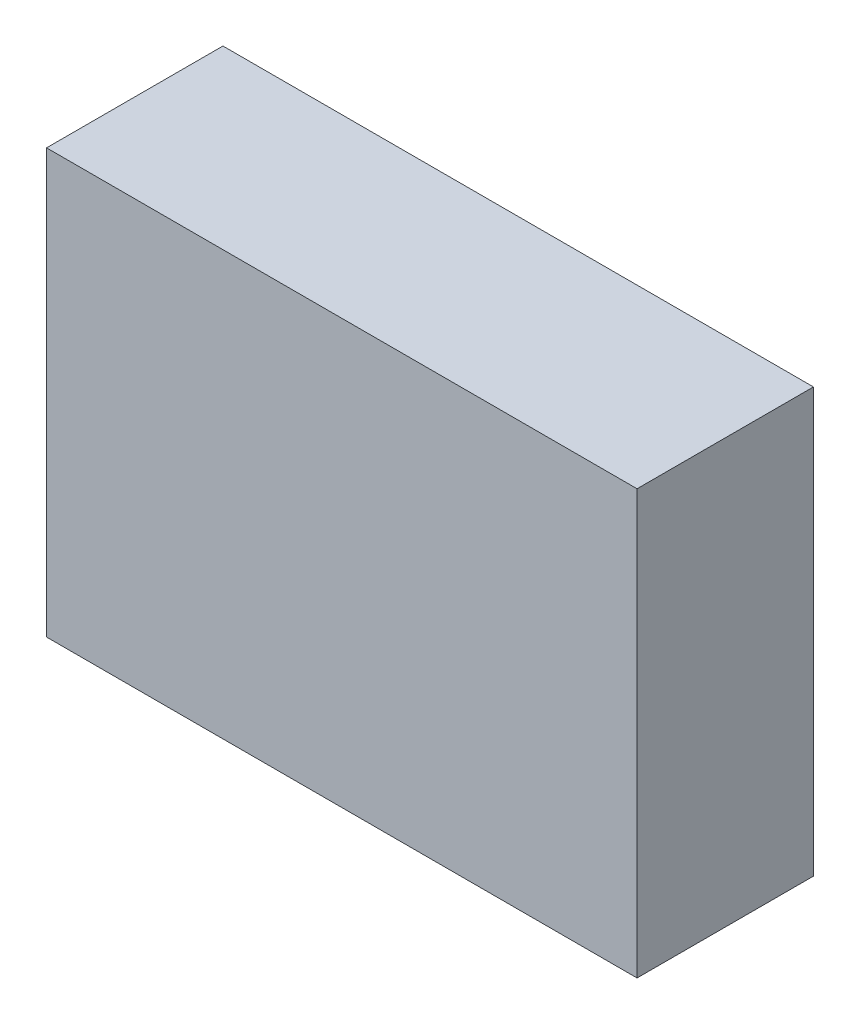
ISO-10303-21;
HEADER;
FILE_DESCRIPTION(('STEP AP214'),'2;1');
FILE_NAME('part.step','',(''),(''),'','','');
FILE_SCHEMA(('AUTOMOTIVE_DESIGN { 1 0 10303 214 1 1 1 1 }'));
ENDSEC;
DATA;
#1=APPLICATION_CONTEXT('core data for automotive mechanical design processes');
#2=APPLICATION_PROTOCOL_DEFINITION('international standard','automotive_design',2000,#1);
#3=PRODUCT_CONTEXT('',#1,'mechanical');
#4=PRODUCT('Part','Part','',(#3));
#5=PRODUCT_RELATED_PRODUCT_CATEGORY('part','',(#4));
#6=PRODUCT_DEFINITION_FORMATION('','',#4);
#7=PRODUCT_DEFINITION_CONTEXT('part definition',#1,'design');
#8=PRODUCT_DEFINITION('design','',#6,#7);
#9=PRODUCT_DEFINITION_SHAPE('','',#8);
#10=(LENGTH_UNIT() NAMED_UNIT(*) SI_UNIT(.MILLI.,.METRE.));
#11=(NAMED_UNIT(*) PLANE_ANGLE_UNIT() SI_UNIT($,.RADIAN.));
#12=(NAMED_UNIT(*) SI_UNIT($,.STERADIAN.) SOLID_ANGLE_UNIT());
#13=UNCERTAINTY_MEASURE_WITH_UNIT(LENGTH_MEASURE(1.E-05),#10,'distance_accuracy_value','');
#14=(GEOMETRIC_REPRESENTATION_CONTEXT(3) GLOBAL_UNCERTAINTY_ASSIGNED_CONTEXT((#13)) GLOBAL_UNIT_ASSIGNED_CONTEXT((#10,
#11,#12)) REPRESENTATION_CONTEXT('',''));
#15=CARTESIAN_POINT('',(0.,0.,0.));
#16=DIRECTION('',(0.,0.,1.));
#17=DIRECTION('',(1.,0.,0.));
#18=AXIS2_PLACEMENT_3D('',#15,#16,#17);
#19=CARTESIAN_POINT('',(0.,0.,9.2));
#20=DIRECTION('',(1.,0.,0.));
#21=DIRECTION('',(0.,0.,-1.));
#22=AXIS2_PLACEMENT_3D('',#19,#20,#21);
#23=PLANE('',#22);
#24=DIRECTION('',(0.,-1.,0.));
#25=VECTOR('',#24,1.);
#26=CARTESIAN_POINT('',(0.,0.,0.));
#27=LINE('',#26,#25);
#28=CARTESIAN_POINT('',(0.,22.1,0.));
#29=VERTEX_POINT('',#28);
#30=CARTESIAN_POINT('',(0.,0.,0.));
#31=VERTEX_POINT('',#30);
#32=EDGE_CURVE('E107',#29,#31,#27,.T.);
#33=ORIENTED_EDGE('',*,*,#32,.T.);
#34=DIRECTION('',(0.,0.,-1.));
#35=VECTOR('',#34,1.);
#36=CARTESIAN_POINT('',(0.,0.,9.2));
#37=LINE('',#36,#35);
#38=CARTESIAN_POINT('',(0.,0.,9.2));
#39=VERTEX_POINT('',#38);
#40=EDGE_CURVE('E11',#39,#31,#37,.T.);
#41=ORIENTED_EDGE('',*,*,#40,.F.);
#42=DIRECTION('',(0.,-1.,0.));
#43=VECTOR('',#42,1.);
#44=CARTESIAN_POINT('',(0.,0.,9.2));
#45=LINE('',#44,#43);
#46=CARTESIAN_POINT('',(0.,22.1,9.2));
#47=VERTEX_POINT('',#46);
#48=EDGE_CURVE('E91',#47,#39,#45,.T.);
#49=ORIENTED_EDGE('',*,*,#48,.F.);
#50=DIRECTION('',(0.,0.,-1.));
#51=VECTOR('',#50,1.);
#52=CARTESIAN_POINT('',(0.,22.1,9.2));
#53=LINE('',#52,#51);
#54=EDGE_CURVE('E103',#47,#29,#53,.T.);
#55=ORIENTED_EDGE('',*,*,#54,.T.);
#56=EDGE_LOOP('',(#33,#41,#49,#55));
#57=FACE_BOUND('',#56,.T.);
#58=ADVANCED_FACE('F39',(#57),#23,.F.);
#59=CARTESIAN_POINT('',(0.,0.,9.2));
#60=DIRECTION('',(0.,1.,0.));
#61=DIRECTION('',(0.,0.,1.));
#62=AXIS2_PLACEMENT_3D('',#59,#60,#61);
#63=PLANE('',#62);
#64=DIRECTION('',(1.,0.,0.));
#65=VECTOR('',#64,1.);
#66=CARTESIAN_POINT('',(0.,0.,0.));
#67=LINE('',#66,#65);
#68=CARTESIAN_POINT('',(30.8,0.,0.));
#69=VERTEX_POINT('',#68);
#70=EDGE_CURVE('E96',#31,#69,#67,.T.);
#71=ORIENTED_EDGE('',*,*,#70,.T.);
#72=DIRECTION('',(0.,0.,-1.));
#73=VECTOR('',#72,1.);
#74=CARTESIAN_POINT('',(30.8,0.,9.2));
#75=LINE('',#74,#73);
#76=CARTESIAN_POINT('',(30.8,0.,9.2));
#77=VERTEX_POINT('',#76);
#78=EDGE_CURVE('E48',#77,#69,#75,.T.);
#79=ORIENTED_EDGE('',*,*,#78,.F.);
#80=DIRECTION('',(1.,0.,0.));
#81=VECTOR('',#80,1.);
#82=CARTESIAN_POINT('',(0.,0.,9.2));
#83=LINE('',#82,#81);
#84=EDGE_CURVE('E86',#39,#77,#83,.T.);
#85=ORIENTED_EDGE('',*,*,#84,.F.);
#86=ORIENTED_EDGE('',*,*,#40,.T.);
#87=EDGE_LOOP('',(#71,#79,#85,#86));
#88=FACE_BOUND('',#87,.T.);
#89=ADVANCED_FACE('F95',(#88),#63,.F.);
#90=CARTESIAN_POINT('',(30.8,0.,9.2));
#91=DIRECTION('',(-1.,0.,0.));
#92=DIRECTION('',(0.,0.,1.));
#93=AXIS2_PLACEMENT_3D('',#90,#91,#92);
#94=PLANE('',#93);
#95=DIRECTION('',(0.,1.,0.));
#96=VECTOR('',#95,1.);
#97=CARTESIAN_POINT('',(30.8,0.,0.));
#98=LINE('',#97,#96);
#99=CARTESIAN_POINT('',(30.8,22.1,0.));
#100=VERTEX_POINT('',#99);
#101=EDGE_CURVE('E73',#69,#100,#98,.T.);
#102=ORIENTED_EDGE('',*,*,#101,.T.);
#103=DIRECTION('',(0.,0.,-1.));
#104=VECTOR('',#103,1.);
#105=CARTESIAN_POINT('',(30.8,22.1,9.2));
#106=LINE('',#105,#104);
#107=CARTESIAN_POINT('',(30.8,22.1,9.2));
#108=VERTEX_POINT('',#107);
#109=EDGE_CURVE('E98',#108,#100,#106,.T.);
#110=ORIENTED_EDGE('',*,*,#109,.F.);
#111=DIRECTION('',(0.,1.,0.));
#112=VECTOR('',#111,1.);
#113=CARTESIAN_POINT('',(30.8,0.,9.2));
#114=LINE('',#113,#112);
#115=EDGE_CURVE('E89',#77,#108,#114,.T.);
#116=ORIENTED_EDGE('',*,*,#115,.F.);
#117=ORIENTED_EDGE('',*,*,#78,.T.);
#118=EDGE_LOOP('',(#102,#110,#116,#117));
#119=FACE_BOUND('',#118,.T.);
#120=ADVANCED_FACE('F99',(#119),#94,.F.);
#121=CARTESIAN_POINT('',(0.,22.1,9.2));
#122=DIRECTION('',(0.,-1.,0.));
#123=DIRECTION('',(0.,0.,-1.));
#124=AXIS2_PLACEMENT_3D('',#121,#122,#123);
#125=PLANE('',#124);
#126=DIRECTION('',(-1.,0.,0.));
#127=VECTOR('',#126,1.);
#128=CARTESIAN_POINT('',(0.,22.1,0.));
#129=LINE('',#128,#127);
#130=EDGE_CURVE('E79',#100,#29,#129,.T.);
#131=ORIENTED_EDGE('',*,*,#130,.T.);
#132=ORIENTED_EDGE('',*,*,#54,.F.);
#133=DIRECTION('',(-1.,0.,0.));
#134=VECTOR('',#133,1.);
#135=CARTESIAN_POINT('',(0.,22.1,9.2));
#136=LINE('',#135,#134);
#137=EDGE_CURVE('E56',#108,#47,#136,.T.);
#138=ORIENTED_EDGE('',*,*,#137,.F.);
#139=ORIENTED_EDGE('',*,*,#109,.T.);
#140=EDGE_LOOP('',(#131,#132,#138,#139));
#141=FACE_BOUND('',#140,.T.);
#142=ADVANCED_FACE('F120',(#141),#125,.F.);
#143=CARTESIAN_POINT('',(0.,0.,9.2));
#144=DIRECTION('',(0.,0.,-1.));
#145=DIRECTION('',(-1.,0.,0.));
#146=AXIS2_PLACEMENT_3D('',#143,#144,#145);
#147=PLANE('',#146);
#148=ORIENTED_EDGE('',*,*,#48,.T.);
#149=ORIENTED_EDGE('',*,*,#84,.T.);
#150=ORIENTED_EDGE('',*,*,#115,.T.);
#151=ORIENTED_EDGE('',*,*,#137,.T.);
#152=EDGE_LOOP('',(#148,#149,#150,#151));
#153=FACE_BOUND('',#152,.T.);
#154=ADVANCED_FACE('F87',(#153),#147,.F.);
#155=CARTESIAN_POINT('',(0.,0.,0.));
#156=DIRECTION('',(0.,0.,-1.));
#157=DIRECTION('',(-1.,0.,0.));
#158=AXIS2_PLACEMENT_3D('',#155,#156,#157);
#159=PLANE('',#158);
#160=ORIENTED_EDGE('',*,*,#32,.F.);
#161=ORIENTED_EDGE('',*,*,#130,.F.);
#162=ORIENTED_EDGE('',*,*,#101,.F.);
#163=ORIENTED_EDGE('',*,*,#70,.F.);
#164=EDGE_LOOP('',(#160,#161,#162,#163));
#165=FACE_BOUND('',#164,.T.);
#166=ADVANCED_FACE('F123',(#165),#159,.T.);
#167=CLOSED_SHELL('',(#58,#89,#120,#142,#154,#166));
#168=MANIFOLD_SOLID_BREP('B2',#167);
#169=ADVANCED_BREP_SHAPE_REPRESENTATION('',(#18,#168),#14);
#170=SHAPE_DEFINITION_REPRESENTATION(#9,#169);
ENDSEC;
END-ISO-10303-21;
